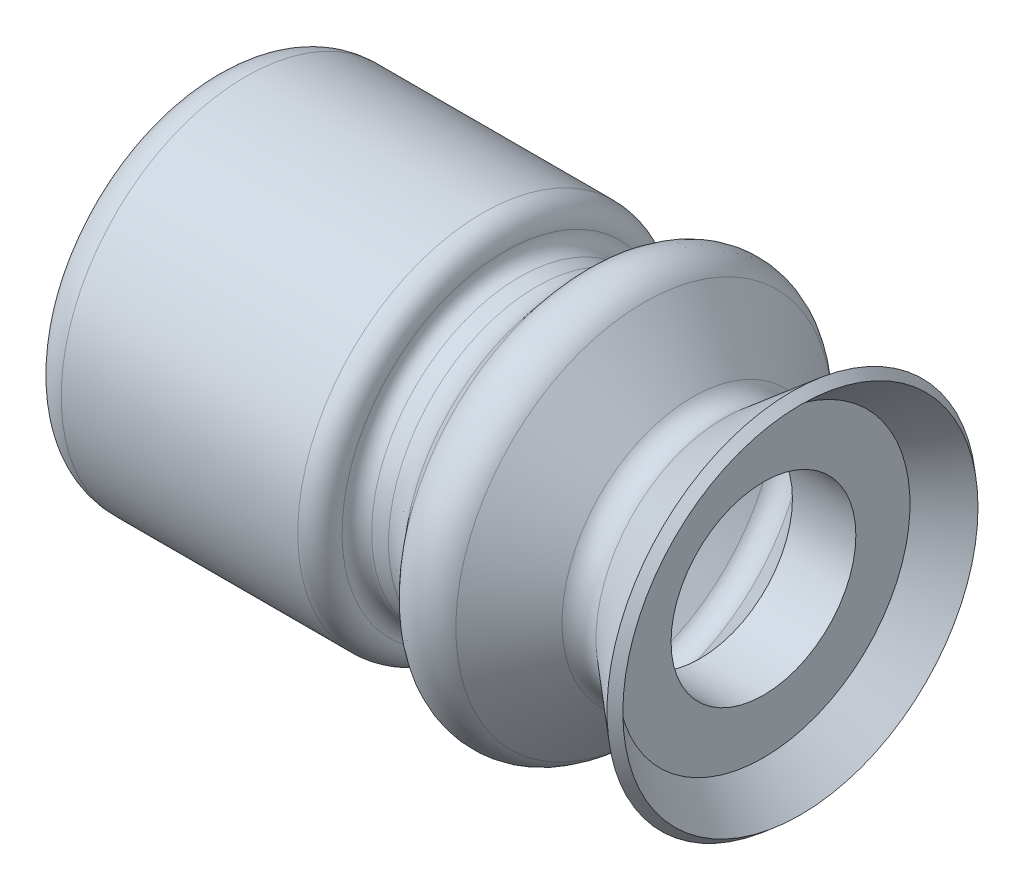
ISO-10303-21;
HEADER;
FILE_DESCRIPTION(('STEP AP214'),'2;1');
FILE_NAME('part.step','',(''),(''),'','','');
FILE_SCHEMA(('AUTOMOTIVE_DESIGN { 1 0 10303 214 1 1 1 1 }'));
ENDSEC;
DATA;
#1=APPLICATION_CONTEXT('core data for automotive mechanical design processes');
#2=APPLICATION_PROTOCOL_DEFINITION('international standard','automotive_design',2000,#1);
#3=PRODUCT_CONTEXT('',#1,'mechanical');
#4=PRODUCT('Part','Part','',(#3));
#5=PRODUCT_RELATED_PRODUCT_CATEGORY('part','',(#4));
#6=PRODUCT_DEFINITION_FORMATION('','',#4);
#7=PRODUCT_DEFINITION_CONTEXT('part definition',#1,'design');
#8=PRODUCT_DEFINITION('design','',#6,#7);
#9=PRODUCT_DEFINITION_SHAPE('','',#8);
#10=(LENGTH_UNIT() NAMED_UNIT(*) SI_UNIT(.MILLI.,.METRE.));
#11=(NAMED_UNIT(*) PLANE_ANGLE_UNIT() SI_UNIT($,.RADIAN.));
#12=(NAMED_UNIT(*) SI_UNIT($,.STERADIAN.) SOLID_ANGLE_UNIT());
#13=UNCERTAINTY_MEASURE_WITH_UNIT(LENGTH_MEASURE(1.E-05),#10,'distance_accuracy_value','');
#14=(GEOMETRIC_REPRESENTATION_CONTEXT(3) GLOBAL_UNCERTAINTY_ASSIGNED_CONTEXT((#13)) GLOBAL_UNIT_ASSIGNED_CONTEXT((#10,
#11,#12)) REPRESENTATION_CONTEXT('',''));
#15=CARTESIAN_POINT('',(0.,0.,0.));
#16=DIRECTION('',(0.,0.,1.));
#17=DIRECTION('',(1.,0.,0.));
#18=AXIS2_PLACEMENT_3D('',#15,#16,#17);
#19=CARTESIAN_POINT('',(0.,0.,0.));
#20=DIRECTION('',(-1.,0.,0.));
#21=DIRECTION('',(0.,-1.,0.));
#22=AXIS2_PLACEMENT_3D('',#19,#20,#21);
#23=CYLINDRICAL_SURFACE('',#22,4.);
#24=CARTESIAN_POINT('',(8.4,0.,0.));
#25=DIRECTION('',(-1.,0.,0.));
#26=DIRECTION('',(0.,-1.,0.));
#27=AXIS2_PLACEMENT_3D('',#24,#25,#26);
#28=CIRCLE('',#27,4.);
#29=CARTESIAN_POINT('',(8.40000000000001,-3.99999999999997,0.));
#30=VERTEX_POINT('',#29);
#31=EDGE_CURVE('E8',#30,#30,#28,.F.);
#32=ORIENTED_EDGE('',*,*,#31,.T.);
#33=EDGE_LOOP('',(#32));
#34=FACE_BOUND('',#33,.T.);
#35=CARTESIAN_POINT('',(8.85553814394479,0.,0.));
#36=DIRECTION('',(-1.,0.,0.));
#37=DIRECTION('',(0.,-1.,0.));
#38=AXIS2_PLACEMENT_3D('',#35,#36,#37);
#39=CIRCLE('',#38,4.);
#40=CARTESIAN_POINT('',(8.8555381439448,-3.99999999999997,0.));
#41=VERTEX_POINT('',#40);
#42=EDGE_CURVE('E32',#41,#41,#39,.T.);
#43=ORIENTED_EDGE('',*,*,#42,.T.);
#44=EDGE_LOOP('',(#43));
#45=FACE_BOUND('',#44,.T.);
#46=ADVANCED_FACE('F12',(#34,#45),#23,.T.);
#47=CARTESIAN_POINT('',(11.,0.,0.));
#48=DIRECTION('',(1.,0.,0.));
#49=DIRECTION('',(0.,1.,0.));
#50=AXIS2_PLACEMENT_3D('',#47,#48,#49);
#51=CONICAL_SURFACE('',#50,5.99994629427463,0.872664625997163);
#52=CARTESIAN_POINT('',(9.62158258706376,0.,0.));
#53=DIRECTION('',(1.,0.,0.));
#54=DIRECTION('',(0.,1.,0.));
#55=AXIS2_PLACEMENT_3D('',#52,#53,#54);
#56=CIRCLE('',#55,4.35721239031346);
#57=CARTESIAN_POINT('',(9.62158258706375,4.35721239031349,0.));
#58=VERTEX_POINT('',#57);
#59=EDGE_CURVE('E23',#58,#58,#56,.T.);
#60=ORIENTED_EDGE('',*,*,#59,.T.);
#61=EDGE_LOOP('',(#60));
#62=FACE_BOUND('',#61,.T.);
#63=CARTESIAN_POINT('',(10.233955556881,0.,0.));
#64=DIRECTION('',(-1.,0.,0.));
#65=DIRECTION('',(0.,-1.,0.));
#66=AXIS2_PLACEMENT_3D('',#63,#64,#65);
#67=CIRCLE('',#66,5.08701007710076);
#68=CARTESIAN_POINT('',(10.233955556881,-5.08701007710072,0.));
#69=VERTEX_POINT('',#68);
#70=EDGE_CURVE('E27',#69,#69,#67,.T.);
#71=ORIENTED_EDGE('',*,*,#70,.T.);
#72=EDGE_LOOP('',(#71));
#73=FACE_BOUND('',#72,.T.);
#74=ADVANCED_FACE('F107',(#62,#73),#51,.T.);
#75=CARTESIAN_POINT('',(13.4618388459784,0.,0.));
#76=DIRECTION('',(-1.,0.,0.));
#77=DIRECTION('',(0.,-1.,0.));
#78=AXIS2_PLACEMENT_3D('',#75,#76,#77);
#79=CONICAL_SURFACE('',#78,3.06604100519184,0.872664625997162);
#80=CARTESIAN_POINT('',(11.766044443119,0.,0.));
#81=DIRECTION('',(1.,0.,0.));
#82=DIRECTION('',(0.,1.,0.));
#83=AXIS2_PLACEMENT_3D('',#80,#81,#82);
#84=CIRCLE('',#83,5.08701007710076);
#85=CARTESIAN_POINT('',(11.766044443119,5.0870100771008,0.));
#86=VERTEX_POINT('',#85);
#87=EDGE_CURVE('E19',#86,#86,#84,.T.);
#88=ORIENTED_EDGE('',*,*,#87,.T.);
#89=EDGE_LOOP('',(#88));
#90=FACE_BOUND('',#89,.T.);
#91=CARTESIAN_POINT('',(13.0761662801665,0.,0.));
#92=DIRECTION('',(-1.,0.,0.));
#93=DIRECTION('',(0.,-1.,0.));
#94=AXIS2_PLACEMENT_3D('',#91,#92,#93);
#95=CIRCLE('',#94,3.52566767106323);
#96=CARTESIAN_POINT('',(13.0761662801665,-3.52566767106318,0.));
#97=VERTEX_POINT('',#96);
#98=EDGE_CURVE('E56',#97,#97,#95,.T.);
#99=ORIENTED_EDGE('',*,*,#98,.T.);
#100=EDGE_LOOP('',(#99));
#101=FACE_BOUND('',#100,.T.);
#102=ADVANCED_FACE('F113',(#90,#101),#79,.T.);
#103=CARTESIAN_POINT('',(15.7666414259709,0.,0.));
#104=DIRECTION('',(1.,0.,0.));
#105=DIRECTION('',(0.,1.,0.));
#106=AXIS2_PLACEMENT_3D('',#103,#104,#105);
#107=CONICAL_SURFACE('',#106,5.,0.698131700797735);
#108=CARTESIAN_POINT('',(13.9214655118498,0.,0.));
#109=DIRECTION('',(1.,0.,0.));
#110=DIRECTION('',(0.,1.,0.));
#111=AXIS2_PLACEMENT_3D('',#108,#109,#110);
#112=CIRCLE('',#111,3.45171357100377);
#113=CARTESIAN_POINT('',(13.9214655118498,3.45171357100382,0.));
#114=VERTEX_POINT('',#113);
#115=EDGE_CURVE('E53',#114,#114,#112,.T.);
#116=ORIENTED_EDGE('',*,*,#115,.T.);
#117=EDGE_LOOP('',(#116));
#118=FACE_BOUND('',#117,.T.);
#119=CARTESIAN_POINT('',(15.7666414259709,0.,0.));
#120=DIRECTION('',(-1.,0.,0.));
#121=DIRECTION('',(0.,-1.,0.));
#122=AXIS2_PLACEMENT_3D('',#119,#120,#121);
#123=CIRCLE('',#122,5.);
#124=CARTESIAN_POINT('',(15.766641425971,-4.99999999999994,0.));
#125=VERTEX_POINT('',#124);
#126=EDGE_CURVE('E59',#125,#125,#123,.T.);
#127=ORIENTED_EDGE('',*,*,#126,.T.);
#128=EDGE_LOOP('',(#127));
#129=FACE_BOUND('',#128,.T.);
#130=ADVANCED_FACE('F224',(#118,#129),#107,.T.);
#131=CARTESIAN_POINT('',(16.,0.,0.));
#132=DIRECTION('',(-1.,0.,0.));
#133=DIRECTION('',(0.,-1.,0.));
#134=AXIS2_PLACEMENT_3D('',#131,#132,#133);
#135=CONICAL_SURFACE('',#134,4.80418890660016,0.698131700797733);
#136=ORIENTED_EDGE('',*,*,#126,.F.);
#137=EDGE_LOOP('',(#136));
#138=FACE_BOUND('',#137,.T.);
#139=CARTESIAN_POINT('',(16.,0.,0.));
#140=DIRECTION('',(-1.,0.,0.));
#141=DIRECTION('',(0.,-1.,0.));
#142=AXIS2_PLACEMENT_3D('',#139,#140,#141);
#143=CIRCLE('',#142,4.80418890660016);
#144=CARTESIAN_POINT('',(16.,-4.8041889066001,0.));
#145=VERTEX_POINT('',#144);
#146=EDGE_CURVE('E62',#145,#145,#143,.T.);
#147=ORIENTED_EDGE('',*,*,#146,.T.);
#148=EDGE_LOOP('',(#147));
#149=FACE_BOUND('',#148,.T.);
#150=ADVANCED_FACE('F216',(#138,#149),#135,.T.);
#151=CARTESIAN_POINT('',(15.,0.,0.));
#152=DIRECTION('',(1.,0.,0.));
#153=DIRECTION('',(0.,1.,0.));
#154=AXIS2_PLACEMENT_3D('',#151,#152,#153);
#155=CONICAL_SURFACE('',#154,3.96508927542287,0.698131700797735);
#156=ORIENTED_EDGE('',*,*,#146,.F.);
#157=EDGE_LOOP('',(#156));
#158=FACE_BOUND('',#157,.T.);
#159=CARTESIAN_POINT('',(15.,0.,0.));
#160=DIRECTION('',(-1.,0.,0.));
#161=DIRECTION('',(0.,-1.,0.));
#162=AXIS2_PLACEMENT_3D('',#159,#160,#161);
#163=CIRCLE('',#162,3.96508927542287);
#164=CARTESIAN_POINT('',(15.,-3.96508927542282,0.));
#165=VERTEX_POINT('',#164);
#166=EDGE_CURVE('E65',#165,#165,#163,.T.);
#167=ORIENTED_EDGE('',*,*,#166,.T.);
#168=EDGE_LOOP('',(#167));
#169=FACE_BOUND('',#168,.T.);
#170=ADVANCED_FACE('F208',(#158,#169),#155,.F.);
#171=CARTESIAN_POINT('',(15.,3.96508927542293,0.));
#172=DIRECTION('',(-1.,0.,0.));
#173=DIRECTION('',(0.,-1.,0.));
#174=AXIS2_PLACEMENT_3D('',#171,#172,#173);
#175=PLANE('',#174);
#176=ORIENTED_EDGE('',*,*,#166,.F.);
#177=EDGE_LOOP('',(#176));
#178=FACE_BOUND('',#177,.T.);
#179=CARTESIAN_POINT('',(15.,0.,0.));
#180=DIRECTION('',(-1.,0.,0.));
#181=DIRECTION('',(0.,-1.,0.));
#182=AXIS2_PLACEMENT_3D('',#179,#180,#181);
#183=CIRCLE('',#182,2.5);
#184=CARTESIAN_POINT('',(15.,-2.49999999999995,0.));
#185=VERTEX_POINT('',#184);
#186=EDGE_CURVE('E68',#185,#185,#183,.T.);
#187=ORIENTED_EDGE('',*,*,#186,.T.);
#188=EDGE_LOOP('',(#187));
#189=FACE_BOUND('',#188,.T.);
#190=ADVANCED_FACE('F200',(#178,#189),#175,.F.);
#191=CARTESIAN_POINT('',(0.,0.,0.));
#192=DIRECTION('',(-1.,0.,0.));
#193=DIRECTION('',(0.,-1.,0.));
#194=AXIS2_PLACEMENT_3D('',#191,#192,#193);
#195=CYLINDRICAL_SURFACE('',#194,2.5);
#196=ORIENTED_EDGE('',*,*,#186,.F.);
#197=EDGE_LOOP('',(#196));
#198=FACE_BOUND('',#197,.T.);
#199=CARTESIAN_POINT('',(13.2841,0.,0.));
#200=DIRECTION('',(-1.,0.,0.));
#201=DIRECTION('',(0.,-1.,0.));
#202=AXIS2_PLACEMENT_3D('',#199,#200,#201);
#203=CIRCLE('',#202,2.5);
#204=CARTESIAN_POINT('',(13.2841,-2.49999999999995,0.));
#205=VERTEX_POINT('',#204);
#206=EDGE_CURVE('E71',#205,#205,#203,.T.);
#207=ORIENTED_EDGE('',*,*,#206,.T.);
#208=EDGE_LOOP('',(#207));
#209=FACE_BOUND('',#208,.T.);
#210=ADVANCED_FACE('F192',(#198,#209),#195,.F.);
#211=CARTESIAN_POINT('',(11.,0.,0.));
#212=DIRECTION('',(-1.,0.,0.));
#213=DIRECTION('',(0.,-1.,0.));
#214=AXIS2_PLACEMENT_3D('',#211,#212,#213);
#215=CONICAL_SURFACE('',#214,5.22208438084442,0.872664625997162);
#216=CARTESIAN_POINT('',(11.3830222215595,0.,0.));
#217=DIRECTION('',(-1.,0.,0.));
#218=DIRECTION('',(0.,-1.,0.));
#219=AXIS2_PLACEMENT_3D('',#216,#217,#218);
#220=CIRCLE('',#219,4.76561627225749);
#221=CARTESIAN_POINT('',(11.3830222215595,-4.76561627225745,0.));
#222=VERTEX_POINT('',#221);
#223=EDGE_CURVE('E44',#222,#222,#220,.T.);
#224=ORIENTED_EDGE('',*,*,#223,.T.);
#225=EDGE_LOOP('',(#224));
#226=FACE_BOUND('',#225,.T.);
#227=ORIENTED_EDGE('',*,*,#206,.F.);
#228=EDGE_LOOP('',(#227));
#229=FACE_BOUND('',#228,.T.);
#230=ADVANCED_FACE('F184',(#226,#229),#215,.F.);
#231=CARTESIAN_POINT('',(9.13544981558865,0.,0.));
#232=DIRECTION('',(1.,0.,0.));
#233=DIRECTION('',(0.,1.,0.));
#234=AXIS2_PLACEMENT_3D('',#231,#232,#233);
#235=CONICAL_SURFACE('',#234,3.,0.872664625997164);
#236=CARTESIAN_POINT('',(10.6169777784405,0.,0.));
#237=DIRECTION('',(1.,0.,0.));
#238=DIRECTION('',(0.,1.,0.));
#239=AXIS2_PLACEMENT_3D('',#236,#237,#238);
#240=CIRCLE('',#239,4.76561627225748);
#241=CARTESIAN_POINT('',(10.6169777784405,4.76561627225752,0.));
#242=VERTEX_POINT('',#241);
#243=EDGE_CURVE('E41',#242,#242,#240,.T.);
#244=ORIENTED_EDGE('',*,*,#243,.T.);
#245=EDGE_LOOP('',(#244));
#246=FACE_BOUND('',#245,.T.);
#247=CARTESIAN_POINT('',(9.13544981558865,0.,0.));
#248=DIRECTION('',(-1.,0.,0.));
#249=DIRECTION('',(0.,-1.,0.));
#250=AXIS2_PLACEMENT_3D('',#247,#248,#249);
#251=CIRCLE('',#250,3.);
#252=CARTESIAN_POINT('',(9.13544981558866,-2.99999999999997,0.));
#253=VERTEX_POINT('',#252);
#254=EDGE_CURVE('E74',#253,#253,#251,.T.);
#255=ORIENTED_EDGE('',*,*,#254,.T.);
#256=EDGE_LOOP('',(#255));
#257=FACE_BOUND('',#256,.T.);
#258=ADVANCED_FACE('F176',(#246,#257),#235,.F.);
#259=CARTESIAN_POINT('',(0.,0.,0.));
#260=DIRECTION('',(-1.,0.,0.));
#261=DIRECTION('',(0.,-1.,0.));
#262=AXIS2_PLACEMENT_3D('',#259,#260,#261);
#263=CYLINDRICAL_SURFACE('',#262,3.);
#264=ORIENTED_EDGE('',*,*,#254,.F.);
#265=EDGE_LOOP('',(#264));
#266=FACE_BOUND('',#265,.T.);
#267=CARTESIAN_POINT('',(3.,0.,0.));
#268=DIRECTION('',(-1.,0.,0.));
#269=DIRECTION('',(0.,-1.,0.));
#270=AXIS2_PLACEMENT_3D('',#267,#268,#269);
#271=CIRCLE('',#270,3.);
#272=CARTESIAN_POINT('',(3.00000000000001,-2.99999999999999,0.));
#273=VERTEX_POINT('',#272);
#274=EDGE_CURVE('E77',#273,#273,#271,.T.);
#275=ORIENTED_EDGE('',*,*,#274,.T.);
#276=EDGE_LOOP('',(#275));
#277=FACE_BOUND('',#276,.T.);
#278=ADVANCED_FACE('F168',(#266,#277),#263,.F.);
#279=CARTESIAN_POINT('',(2.99999999999999,3.00000000000001,0.));
#280=DIRECTION('',(-1.,0.,0.));
#281=DIRECTION('',(0.,-1.,0.));
#282=AXIS2_PLACEMENT_3D('',#279,#280,#281);
#283=PLANE('',#282);
#284=ORIENTED_EDGE('',*,*,#274,.F.);
#285=EDGE_LOOP('',(#284));
#286=FACE_BOUND('',#285,.T.);
#287=CARTESIAN_POINT('',(3.,0.,0.));
#288=DIRECTION('',(-1.,0.,0.));
#289=DIRECTION('',(0.,-1.,0.));
#290=AXIS2_PLACEMENT_3D('',#287,#288,#289);
#291=CIRCLE('',#290,2.);
#292=CARTESIAN_POINT('',(3.00000000000001,-1.99999999999999,0.));
#293=VERTEX_POINT('',#292);
#294=EDGE_CURVE('E80',#293,#293,#291,.T.);
#295=ORIENTED_EDGE('',*,*,#294,.T.);
#296=EDGE_LOOP('',(#295));
#297=FACE_BOUND('',#296,.T.);
#298=ADVANCED_FACE('F103',(#286,#297),#283,.F.);
#299=CARTESIAN_POINT('',(0.,0.,0.));
#300=DIRECTION('',(-1.,0.,0.));
#301=DIRECTION('',(0.,-1.,0.));
#302=AXIS2_PLACEMENT_3D('',#299,#300,#301);
#303=CYLINDRICAL_SURFACE('',#302,2.);
#304=ORIENTED_EDGE('',*,*,#294,.F.);
#305=EDGE_LOOP('',(#304));
#306=FACE_BOUND('',#305,.T.);
#307=CARTESIAN_POINT('',(0.,0.,0.));
#308=DIRECTION('',(-1.,0.,0.));
#309=DIRECTION('',(0.,-1.,0.));
#310=AXIS2_PLACEMENT_3D('',#307,#308,#309);
#311=CIRCLE('',#310,2.);
#312=CARTESIAN_POINT('',(0.,-2.,0.));
#313=VERTEX_POINT('',#312);
#314=EDGE_CURVE('E83',#313,#313,#311,.T.);
#315=ORIENTED_EDGE('',*,*,#314,.T.);
#316=EDGE_LOOP('',(#315));
#317=FACE_BOUND('',#316,.T.);
#318=ADVANCED_FACE('F87',(#306,#317),#303,.F.);
#319=CARTESIAN_POINT('',(0.,2.,0.));
#320=DIRECTION('',(1.,0.,0.));
#321=DIRECTION('',(0.,1.,0.));
#322=AXIS2_PLACEMENT_3D('',#319,#320,#321);
#323=PLANE('',#322);
#324=CARTESIAN_POINT('',(0.,0.,0.));
#325=DIRECTION('',(1.,0.,0.));
#326=DIRECTION('',(0.,1.,0.));
#327=AXIS2_PLACEMENT_3D('',#324,#325,#326);
#328=CIRCLE('',#327,4.);
#329=CARTESIAN_POINT('',(0.,4.,0.));
#330=VERTEX_POINT('',#329);
#331=EDGE_CURVE('E38',#330,#330,#328,.F.);
#332=ORIENTED_EDGE('',*,*,#331,.T.);
#333=EDGE_LOOP('',(#332));
#334=FACE_BOUND('',#333,.T.);
#335=ORIENTED_EDGE('',*,*,#314,.F.);
#336=EDGE_LOOP('',(#335));
#337=FACE_BOUND('',#336,.T.);
#338=ADVANCED_FACE('F89',(#334,#337),#323,.F.);
#339=CARTESIAN_POINT('',(0.,0.,0.));
#340=DIRECTION('',(-1.,0.,0.));
#341=DIRECTION('',(0.,-1.,0.));
#342=AXIS2_PLACEMENT_3D('',#339,#340,#341);
#343=CYLINDRICAL_SURFACE('',#342,5.);
#344=CARTESIAN_POINT('',(1.,0.,0.));
#345=DIRECTION('',(1.,0.,0.));
#346=DIRECTION('',(0.,1.,0.));
#347=AXIS2_PLACEMENT_3D('',#344,#345,#346);
#348=CIRCLE('',#347,5.);
#349=CARTESIAN_POINT('',(0.999999999999982,5.,0.));
#350=VERTEX_POINT('',#349);
#351=EDGE_CURVE('E35',#350,#350,#348,.T.);
#352=ORIENTED_EDGE('',*,*,#351,.T.);
#353=EDGE_LOOP('',(#352));
#354=FACE_BOUND('',#353,.T.);
#355=CARTESIAN_POINT('',(7.4,0.,0.));
#356=DIRECTION('',(-1.,0.,0.));
#357=DIRECTION('',(0.,-1.,0.));
#358=AXIS2_PLACEMENT_3D('',#355,#356,#357);
#359=CIRCLE('',#358,5.);
#360=CARTESIAN_POINT('',(7.40000000000002,-4.99999999999997,0.));
#361=VERTEX_POINT('',#360);
#362=EDGE_CURVE('E50',#361,#361,#359,.T.);
#363=ORIENTED_EDGE('',*,*,#362,.T.);
#364=EDGE_LOOP('',(#363));
#365=FACE_BOUND('',#364,.T.);
#366=ADVANCED_FACE('F91',(#354,#365),#343,.T.);
#367=CARTESIAN_POINT('',(13.5357929460379,0.,0.));
#368=DIRECTION('',(-1.,0.,0.));
#369=DIRECTION('',(0.,-1.,0.));
#370=AXIS2_PLACEMENT_3D('',#367,#368,#369);
#371=TOROIDAL_SURFACE('',#370,3.91134023687515,0.6);
#372=ORIENTED_EDGE('',*,*,#115,.F.);
#373=EDGE_LOOP('',(#372));
#374=FACE_BOUND('',#373,.T.);
#375=ORIENTED_EDGE('',*,*,#98,.F.);
#376=EDGE_LOOP('',(#375));
#377=FACE_BOUND('',#376,.T.);
#378=ADVANCED_FACE('F100',(#374,#377),#371,.F.);
#379=CARTESIAN_POINT('',(7.4,0.,0.));
#380=DIRECTION('',(-1.,0.,0.));
#381=DIRECTION('',(0.,-1.,0.));
#382=AXIS2_PLACEMENT_3D('',#379,#380,#381);
#383=TOROIDAL_SURFACE('',#382,4.4,0.6);
#384=CARTESIAN_POINT('',(8.,0.,0.));
#385=DIRECTION('',(-1.,0.,0.));
#386=DIRECTION('',(0.,-1.,0.));
#387=AXIS2_PLACEMENT_3D('',#384,#385,#386);
#388=CIRCLE('',#387,4.4);
#389=CARTESIAN_POINT('',(8.00000000000002,-4.39999999999997,0.));
#390=VERTEX_POINT('',#389);
#391=EDGE_CURVE('E47',#390,#390,#388,.F.);
#392=ORIENTED_EDGE('',*,*,#391,.F.);
#393=EDGE_LOOP('',(#392));
#394=FACE_BOUND('',#393,.T.);
#395=ORIENTED_EDGE('',*,*,#362,.F.);
#396=EDGE_LOOP('',(#395));
#397=FACE_BOUND('',#396,.T.);
#398=ADVANCED_FACE('F121',(#394,#397),#383,.T.);
#399=CARTESIAN_POINT('',(11.,0.,0.));
#400=DIRECTION('',(-1.,0.,0.));
#401=DIRECTION('',(0.,-1.,0.));
#402=AXIS2_PLACEMENT_3D('',#399,#400,#401);
#403=TOROIDAL_SURFACE('',#402,4.44422246741422,0.5);
#404=ORIENTED_EDGE('',*,*,#243,.F.);
#405=EDGE_LOOP('',(#404));
#406=FACE_BOUND('',#405,.T.);
#407=ORIENTED_EDGE('',*,*,#223,.F.);
#408=EDGE_LOOP('',(#407));
#409=FACE_BOUND('',#408,.T.);
#410=ADVANCED_FACE('F125',(#406,#409),#403,.F.);
#411=CARTESIAN_POINT('',(1.,0.,0.));
#412=DIRECTION('',(1.,0.,0.));
#413=DIRECTION('',(0.,1.,0.));
#414=AXIS2_PLACEMENT_3D('',#411,#412,#413);
#415=TOROIDAL_SURFACE('',#414,4.,1.);
#416=ORIENTED_EDGE('',*,*,#351,.F.);
#417=EDGE_LOOP('',(#416));
#418=FACE_BOUND('',#417,.T.);
#419=ORIENTED_EDGE('',*,*,#331,.F.);
#420=EDGE_LOOP('',(#419));
#421=FACE_BOUND('',#420,.T.);
#422=ADVANCED_FACE('F129',(#418,#421),#415,.T.);
#423=CARTESIAN_POINT('',(8.85553814394479,0.,0.));
#424=DIRECTION('',(-1.,0.,0.));
#425=DIRECTION('',(0.,-1.,0.));
#426=AXIS2_PLACEMENT_3D('',#423,#424,#425);
#427=TOROIDAL_SURFACE('',#426,5.,1.);
#428=ORIENTED_EDGE('',*,*,#59,.F.);
#429=EDGE_LOOP('',(#428));
#430=FACE_BOUND('',#429,.T.);
#431=ORIENTED_EDGE('',*,*,#42,.F.);
#432=EDGE_LOOP('',(#431));
#433=FACE_BOUND('',#432,.T.);
#434=ADVANCED_FACE('F133',(#430,#433),#427,.F.);
#435=CARTESIAN_POINT('',(11.,0.,0.));
#436=DIRECTION('',(1.,0.,0.));
#437=DIRECTION('',(0.,1.,0.));
#438=AXIS2_PLACEMENT_3D('',#435,#436,#437);
#439=TOROIDAL_SURFACE('',#438,4.44422246741422,1.);
#440=ORIENTED_EDGE('',*,*,#87,.F.);
#441=EDGE_LOOP('',(#440));
#442=FACE_BOUND('',#441,.T.);
#443=ORIENTED_EDGE('',*,*,#70,.F.);
#444=EDGE_LOOP('',(#443));
#445=FACE_BOUND('',#444,.T.);
#446=ADVANCED_FACE('F136',(#442,#445),#439,.T.);
#447=CARTESIAN_POINT('',(8.4,0.,0.));
#448=DIRECTION('',(-1.,0.,0.));
#449=DIRECTION('',(0.,-1.,0.));
#450=AXIS2_PLACEMENT_3D('',#447,#448,#449);
#451=TOROIDAL_SURFACE('',#450,4.4,0.4);
#452=ORIENTED_EDGE('',*,*,#31,.F.);
#453=EDGE_LOOP('',(#452));
#454=FACE_BOUND('',#453,.T.);
#455=ORIENTED_EDGE('',*,*,#391,.T.);
#456=EDGE_LOOP('',(#455));
#457=FACE_BOUND('',#456,.T.);
#458=ADVANCED_FACE('F14',(#454,#457),#451,.F.);
#459=CLOSED_SHELL('',(#46,#74,#102,#130,#150,#170,#190,#210,#230,#258,#278,#298,#318,#338,#366,
#378,#398,#410,#422,#434,#446,#458));
#460=MANIFOLD_SOLID_BREP('B1',#459);
#461=ADVANCED_BREP_SHAPE_REPRESENTATION('',(#18,#460),#14);
#462=SHAPE_DEFINITION_REPRESENTATION(#9,#461);
ENDSEC;
END-ISO-10303-21;
